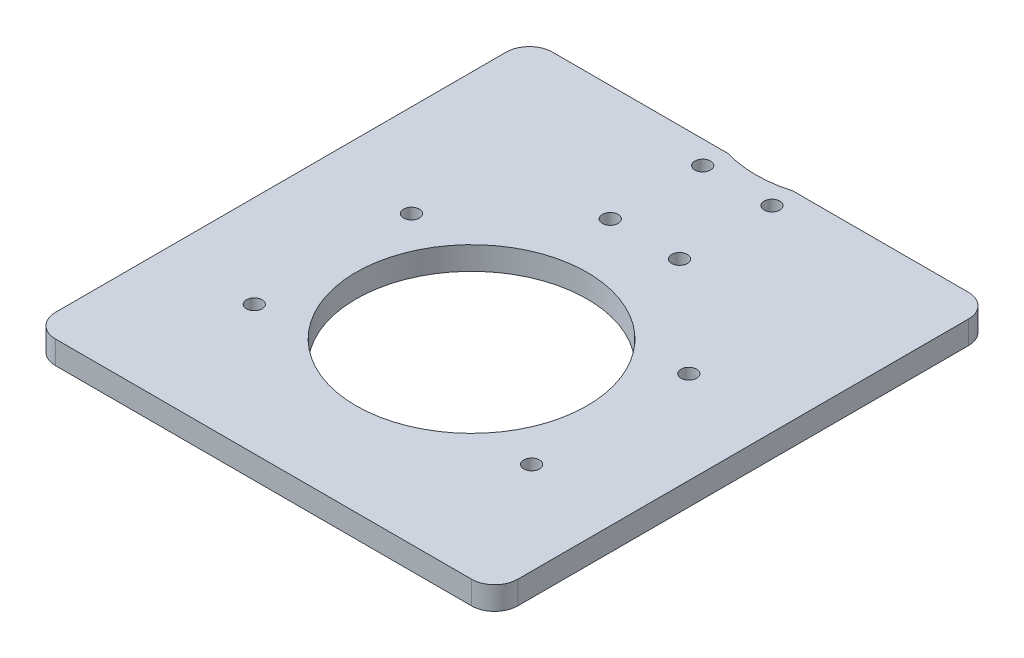
ISO-10303-21;
HEADER;
FILE_DESCRIPTION(('STEP AP214'),'2;1');
FILE_NAME('part.step','',(''),(''),'','','');
FILE_SCHEMA(('AUTOMOTIVE_DESIGN { 1 0 10303 214 1 1 1 1 }'));
ENDSEC;
DATA;
#1=APPLICATION_CONTEXT('core data for automotive mechanical design processes');
#2=APPLICATION_PROTOCOL_DEFINITION('international standard','automotive_design',2000,#1);
#3=PRODUCT_CONTEXT('',#1,'mechanical');
#4=PRODUCT('Part','Part','',(#3));
#5=PRODUCT_RELATED_PRODUCT_CATEGORY('part','',(#4));
#6=PRODUCT_DEFINITION_FORMATION('','',#4);
#7=PRODUCT_DEFINITION_CONTEXT('part definition',#1,'design');
#8=PRODUCT_DEFINITION('design','',#6,#7);
#9=PRODUCT_DEFINITION_SHAPE('','',#8);
#10=(LENGTH_UNIT() NAMED_UNIT(*) SI_UNIT(.MILLI.,.METRE.));
#11=(NAMED_UNIT(*) PLANE_ANGLE_UNIT() SI_UNIT($,.RADIAN.));
#12=(NAMED_UNIT(*) SI_UNIT($,.STERADIAN.) SOLID_ANGLE_UNIT());
#13=UNCERTAINTY_MEASURE_WITH_UNIT(LENGTH_MEASURE(1.E-05),#10,'distance_accuracy_value','');
#14=(GEOMETRIC_REPRESENTATION_CONTEXT(3) GLOBAL_UNCERTAINTY_ASSIGNED_CONTEXT((#13)) GLOBAL_UNIT_ASSIGNED_CONTEXT((#10,
#11,#12)) REPRESENTATION_CONTEXT('',''));
#15=CARTESIAN_POINT('',(0.,0.,0.));
#16=DIRECTION('',(0.,0.,1.));
#17=DIRECTION('',(1.,0.,0.));
#18=AXIS2_PLACEMENT_3D('',#15,#16,#17);
#19=CARTESIAN_POINT('',(100.,10.,-107.5));
#20=DIRECTION('',(0.,0.,1.));
#21=DIRECTION('',(1.,0.,0.));
#22=AXIS2_PLACEMENT_3D('',#19,#20,#21);
#23=PLANE('',#22);
#24=DIRECTION('',(-1.,0.,0.));
#25=VECTOR('',#24,1.);
#26=CARTESIAN_POINT('',(100.,10.,-107.5));
#27=LINE('',#26,#25);
#28=CARTESIAN_POINT('',(90.,10.,-107.5));
#29=VERTEX_POINT('',#28);
#30=CARTESIAN_POINT('',(13.9999999999999,10.,-107.5));
#31=VERTEX_POINT('',#30);
#32=EDGE_CURVE('E220',#29,#31,#27,.T.);
#33=ORIENTED_EDGE('',*,*,#32,.F.);
#34=DIRECTION('',(0.,-1.,0.));
#35=VECTOR('',#34,1.);
#36=CARTESIAN_POINT('',(90.,10.,-107.5));
#37=LINE('',#36,#35);
#38=CARTESIAN_POINT('',(90.,0.,-107.5));
#39=VERTEX_POINT('',#38);
#40=EDGE_CURVE('E11',#29,#39,#37,.T.);
#41=ORIENTED_EDGE('',*,*,#40,.T.);
#42=DIRECTION('',(-1.,0.,0.));
#43=VECTOR('',#42,1.);
#44=CARTESIAN_POINT('',(100.,0.,-107.5));
#45=LINE('',#44,#43);
#46=CARTESIAN_POINT('',(13.9999999999999,0.,-107.5));
#47=VERTEX_POINT('',#46);
#48=EDGE_CURVE('E214',#39,#47,#45,.T.);
#49=ORIENTED_EDGE('',*,*,#48,.T.);
#50=DIRECTION('',(0.,1.,0.));
#51=VECTOR('',#50,1.);
#52=CARTESIAN_POINT('',(13.9999999999999,0.,-107.5));
#53=LINE('',#52,#51);
#54=EDGE_CURVE('E163',#47,#31,#53,.T.);
#55=ORIENTED_EDGE('',*,*,#54,.T.);
#56=EDGE_LOOP('',(#33,#41,#49,#55));
#57=FACE_BOUND('',#56,.T.);
#58=ADVANCED_FACE('F34',(#57),#23,.F.);
#59=CARTESIAN_POINT('',(-100.,10.,107.5));
#60=DIRECTION('',(1.,0.,0.));
#61=DIRECTION('',(0.,0.,-1.));
#62=AXIS2_PLACEMENT_3D('',#59,#60,#61);
#63=PLANE('',#62);
#64=DIRECTION('',(0.,0.,1.));
#65=VECTOR('',#64,1.);
#66=CARTESIAN_POINT('',(-100.,0.,107.5));
#67=LINE('',#66,#65);
#68=CARTESIAN_POINT('',(-100.,0.,-97.5));
#69=VERTEX_POINT('',#68);
#70=CARTESIAN_POINT('',(-100.,0.,97.5));
#71=VERTEX_POINT('',#70);
#72=EDGE_CURVE('E210',#69,#71,#67,.T.);
#73=ORIENTED_EDGE('',*,*,#72,.T.);
#74=DIRECTION('',(0.,-1.,0.));
#75=VECTOR('',#74,1.);
#76=CARTESIAN_POINT('',(-100.,10.,97.5));
#77=LINE('',#76,#75);
#78=CARTESIAN_POINT('',(-100.,10.,97.5));
#79=VERTEX_POINT('',#78);
#80=EDGE_CURVE('E57',#71,#79,#77,.F.);
#81=ORIENTED_EDGE('',*,*,#80,.T.);
#82=DIRECTION('',(0.,0.,1.));
#83=VECTOR('',#82,1.);
#84=CARTESIAN_POINT('',(-100.,10.,107.5));
#85=LINE('',#84,#83);
#86=CARTESIAN_POINT('',(-100.,10.,-97.5));
#87=VERTEX_POINT('',#86);
#88=EDGE_CURVE('E211',#87,#79,#85,.T.);
#89=ORIENTED_EDGE('',*,*,#88,.F.);
#90=DIRECTION('',(0.,-1.,0.));
#91=VECTOR('',#90,1.);
#92=CARTESIAN_POINT('',(-100.,10.,-97.5));
#93=LINE('',#92,#91);
#94=EDGE_CURVE('E269',#87,#69,#93,.T.);
#95=ORIENTED_EDGE('',*,*,#94,.T.);
#96=EDGE_LOOP('',(#73,#81,#89,#95));
#97=FACE_BOUND('',#96,.T.);
#98=ADVANCED_FACE('F287',(#97),#63,.F.);
#99=CARTESIAN_POINT('',(100.,10.,107.5));
#100=DIRECTION('',(0.,0.,-1.));
#101=DIRECTION('',(-1.,0.,0.));
#102=AXIS2_PLACEMENT_3D('',#99,#100,#101);
#103=PLANE('',#102);
#104=DIRECTION('',(1.,0.,0.));
#105=VECTOR('',#104,1.);
#106=CARTESIAN_POINT('',(100.,0.,107.5));
#107=LINE('',#106,#105);
#108=CARTESIAN_POINT('',(-90.,0.,107.5));
#109=VERTEX_POINT('',#108);
#110=CARTESIAN_POINT('',(90.,0.,107.5));
#111=VERTEX_POINT('',#110);
#112=EDGE_CURVE('E224',#109,#111,#107,.T.);
#113=ORIENTED_EDGE('',*,*,#112,.T.);
#114=DIRECTION('',(0.,-1.,0.));
#115=VECTOR('',#114,1.);
#116=CARTESIAN_POINT('',(90.,10.,107.5));
#117=LINE('',#116,#115);
#118=CARTESIAN_POINT('',(90.,10.,107.5));
#119=VERTEX_POINT('',#118);
#120=EDGE_CURVE('E260',#111,#119,#117,.F.);
#121=ORIENTED_EDGE('',*,*,#120,.T.);
#122=DIRECTION('',(1.,0.,0.));
#123=VECTOR('',#122,1.);
#124=CARTESIAN_POINT('',(100.,10.,107.5));
#125=LINE('',#124,#123);
#126=CARTESIAN_POINT('',(-90.,10.,107.5));
#127=VERTEX_POINT('',#126);
#128=EDGE_CURVE('E213',#127,#119,#125,.T.);
#129=ORIENTED_EDGE('',*,*,#128,.F.);
#130=DIRECTION('',(0.,-1.,0.));
#131=VECTOR('',#130,1.);
#132=CARTESIAN_POINT('',(-90.,10.,107.5));
#133=LINE('',#132,#131);
#134=EDGE_CURVE('E257',#127,#109,#133,.T.);
#135=ORIENTED_EDGE('',*,*,#134,.T.);
#136=EDGE_LOOP('',(#113,#121,#129,#135));
#137=FACE_BOUND('',#136,.T.);
#138=ADVANCED_FACE('F298',(#137),#103,.F.);
#139=CARTESIAN_POINT('',(100.,10.,107.5));
#140=DIRECTION('',(-1.,0.,0.));
#141=DIRECTION('',(0.,0.,1.));
#142=AXIS2_PLACEMENT_3D('',#139,#140,#141);
#143=PLANE('',#142);
#144=DIRECTION('',(0.,0.,-1.));
#145=VECTOR('',#144,1.);
#146=CARTESIAN_POINT('',(100.,10.,107.5));
#147=LINE('',#146,#145);
#148=CARTESIAN_POINT('',(100.,10.,97.5));
#149=VERTEX_POINT('',#148);
#150=CARTESIAN_POINT('',(100.,10.,-97.5));
#151=VERTEX_POINT('',#150);
#152=EDGE_CURVE('E217',#149,#151,#147,.T.);
#153=ORIENTED_EDGE('',*,*,#152,.F.);
#154=DIRECTION('',(0.,-1.,0.));
#155=VECTOR('',#154,1.);
#156=CARTESIAN_POINT('',(100.,10.,97.5));
#157=LINE('',#156,#155);
#158=CARTESIAN_POINT('',(100.,0.,97.5));
#159=VERTEX_POINT('',#158);
#160=EDGE_CURVE('E246',#149,#159,#157,.T.);
#161=ORIENTED_EDGE('',*,*,#160,.T.);
#162=DIRECTION('',(0.,0.,-1.));
#163=VECTOR('',#162,1.);
#164=CARTESIAN_POINT('',(100.,0.,107.5));
#165=LINE('',#164,#163);
#166=CARTESIAN_POINT('',(100.,0.,-97.5));
#167=VERTEX_POINT('',#166);
#168=EDGE_CURVE('E227',#159,#167,#165,.T.);
#169=ORIENTED_EDGE('',*,*,#168,.T.);
#170=DIRECTION('',(0.,-1.,0.));
#171=VECTOR('',#170,1.);
#172=CARTESIAN_POINT('',(100.,10.,-97.5));
#173=LINE('',#172,#171);
#174=EDGE_CURVE('E244',#167,#151,#173,.F.);
#175=ORIENTED_EDGE('',*,*,#174,.T.);
#176=EDGE_LOOP('',(#153,#161,#169,#175));
#177=FACE_BOUND('',#176,.T.);
#178=ADVANCED_FACE('F306',(#177),#143,.F.);
#179=CARTESIAN_POINT('',(-13.9999999999999,0.,-107.5));
#180=VERTEX_POINT('',#179);
#181=CARTESIAN_POINT('',(-90.,0.,-107.5));
#182=VERTEX_POINT('',#181);
#183=EDGE_CURVE('E230',#180,#182,#45,.T.);
#184=ORIENTED_EDGE('',*,*,#183,.T.);
#185=DIRECTION('',(0.,-1.,0.));
#186=VECTOR('',#185,1.);
#187=CARTESIAN_POINT('',(-90.,10.,-107.5));
#188=LINE('',#187,#186);
#189=CARTESIAN_POINT('',(-90.,10.,-107.5));
#190=VERTEX_POINT('',#189);
#191=EDGE_CURVE('E42',#182,#190,#188,.F.);
#192=ORIENTED_EDGE('',*,*,#191,.T.);
#193=CARTESIAN_POINT('',(-13.9999999999999,10.,-107.5));
#194=VERTEX_POINT('',#193);
#195=EDGE_CURVE('E219',#194,#190,#27,.T.);
#196=ORIENTED_EDGE('',*,*,#195,.F.);
#197=DIRECTION('',(0.,1.,0.));
#198=VECTOR('',#197,1.);
#199=CARTESIAN_POINT('',(-13.9999999999999,0.,-107.5));
#200=LINE('',#199,#198);
#201=EDGE_CURVE('E160',#194,#180,#200,.F.);
#202=ORIENTED_EDGE('',*,*,#201,.T.);
#203=EDGE_LOOP('',(#184,#192,#196,#202));
#204=FACE_BOUND('',#203,.T.);
#205=ADVANCED_FACE('F277',(#204),#23,.F.);
#206=CARTESIAN_POINT('',(0.,10.,0.));
#207=DIRECTION('',(0.,1.,0.));
#208=DIRECTION('',(0.,0.,1.));
#209=AXIS2_PLACEMENT_3D('',#206,#207,#208);
#210=PLANE('',#209);
#211=ORIENTED_EDGE('',*,*,#128,.T.);
#212=CARTESIAN_POINT('',(90.,10.,97.5));
#213=DIRECTION('',(0.,1.,0.));
#214=DIRECTION('',(0.,0.,1.));
#215=AXIS2_PLACEMENT_3D('',#212,#213,#214);
#216=CIRCLE('',#215,10.);
#217=EDGE_CURVE('E267',#119,#149,#216,.T.);
#218=ORIENTED_EDGE('',*,*,#217,.T.);
#219=ORIENTED_EDGE('',*,*,#152,.T.);
#220=CARTESIAN_POINT('',(90.,10.,-97.5));
#221=DIRECTION('',(0.,1.,0.));
#222=DIRECTION('',(0.,0.,1.));
#223=AXIS2_PLACEMENT_3D('',#220,#221,#222);
#224=CIRCLE('',#223,10.);
#225=EDGE_CURVE('E49',#151,#29,#224,.T.);
#226=ORIENTED_EDGE('',*,*,#225,.T.);
#227=ORIENTED_EDGE('',*,*,#32,.T.);
#228=CARTESIAN_POINT('',(0.,10.,-155.5));
#229=DIRECTION('',(0.,1.,0.));
#230=DIRECTION('',(0.,0.,1.));
#231=AXIS2_PLACEMENT_3D('',#228,#229,#230);
#232=CIRCLE('',#231,50.);
#233=EDGE_CURVE('E157',#194,#31,#232,.T.);
#234=ORIENTED_EDGE('',*,*,#233,.F.);
#235=ORIENTED_EDGE('',*,*,#195,.T.);
#236=CARTESIAN_POINT('',(-90.,10.,-97.5));
#237=DIRECTION('',(0.,1.,0.));
#238=DIRECTION('',(0.,0.,1.));
#239=AXIS2_PLACEMENT_3D('',#236,#237,#238);
#240=CIRCLE('',#239,10.);
#241=EDGE_CURVE('E263',#190,#87,#240,.T.);
#242=ORIENTED_EDGE('',*,*,#241,.T.);
#243=ORIENTED_EDGE('',*,*,#88,.T.);
#244=CARTESIAN_POINT('',(-90.,10.,97.5));
#245=DIRECTION('',(0.,1.,0.));
#246=DIRECTION('',(0.,0.,1.));
#247=AXIS2_PLACEMENT_3D('',#244,#245,#246);
#248=CIRCLE('',#247,10.);
#249=EDGE_CURVE('E265',#79,#127,#248,.T.);
#250=ORIENTED_EDGE('',*,*,#249,.T.);
#251=EDGE_LOOP('',(#211,#218,#219,#226,#227,#234,#235,#242,#243,#250));
#252=FACE_BOUND('',#251,.T.);
#253=CARTESIAN_POINT('',(0.,10.,17.5));
#254=DIRECTION('',(0.,1.,0.));
#255=DIRECTION('',(0.,0.,1.));
#256=AXIS2_PLACEMENT_3D('',#253,#254,#255);
#257=CIRCLE('',#256,50.);
#258=CARTESIAN_POINT('',(0.,10.,67.5));
#259=VERTEX_POINT('',#258);
#260=EDGE_CURVE('E166',#259,#259,#257,.T.);
#261=ORIENTED_EDGE('',*,*,#260,.F.);
#262=EDGE_LOOP('',(#261));
#263=FACE_BOUND('',#262,.T.);
#264=CARTESIAN_POINT('',(-15.,10.,-97.5));
#265=DIRECTION('',(0.,1.,0.));
#266=DIRECTION('',(0.,0.,1.));
#267=AXIS2_PLACEMENT_3D('',#264,#265,#266);
#268=CIRCLE('',#267,3.39999999999999);
#269=CARTESIAN_POINT('',(-15.,10.,-94.1));
#270=VERTEX_POINT('',#269);
#271=EDGE_CURVE('E170',#270,#270,#268,.T.);
#272=ORIENTED_EDGE('',*,*,#271,.F.);
#273=EDGE_LOOP('',(#272));
#274=FACE_BOUND('',#273,.T.);
#275=CARTESIAN_POINT('',(-15.,10.,-57.5));
#276=DIRECTION('',(0.,1.,0.));
#277=DIRECTION('',(0.,0.,1.));
#278=AXIS2_PLACEMENT_3D('',#275,#276,#277);
#279=CIRCLE('',#278,3.39999999999999);
#280=CARTESIAN_POINT('',(-15.,10.,-54.1));
#281=VERTEX_POINT('',#280);
#282=EDGE_CURVE('E176',#281,#281,#279,.T.);
#283=ORIENTED_EDGE('',*,*,#282,.F.);
#284=EDGE_LOOP('',(#283));
#285=FACE_BOUND('',#284,.T.);
#286=CARTESIAN_POINT('',(15.,10.,-57.5));
#287=DIRECTION('',(0.,1.,0.));
#288=DIRECTION('',(0.,0.,1.));
#289=AXIS2_PLACEMENT_3D('',#286,#287,#288);
#290=CIRCLE('',#289,3.39999999999999);
#291=CARTESIAN_POINT('',(15.,10.,-54.1));
#292=VERTEX_POINT('',#291);
#293=EDGE_CURVE('E180',#292,#292,#290,.T.);
#294=ORIENTED_EDGE('',*,*,#293,.F.);
#295=EDGE_LOOP('',(#294));
#296=FACE_BOUND('',#295,.T.);
#297=CARTESIAN_POINT('',(15.,10.,-97.5));
#298=DIRECTION('',(0.,1.,0.));
#299=DIRECTION('',(0.,0.,1.));
#300=AXIS2_PLACEMENT_3D('',#297,#298,#299);
#301=CIRCLE('',#300,3.39999999999999);
#302=CARTESIAN_POINT('',(15.,10.,-94.1));
#303=VERTEX_POINT('',#302);
#304=EDGE_CURVE('E184',#303,#303,#301,.T.);
#305=ORIENTED_EDGE('',*,*,#304,.F.);
#306=EDGE_LOOP('',(#305));
#307=FACE_BOUND('',#306,.T.);
#308=CARTESIAN_POINT('',(-60.,10.,-16.5));
#309=DIRECTION('',(0.,1.,0.));
#310=DIRECTION('',(0.,0.,1.));
#311=AXIS2_PLACEMENT_3D('',#308,#309,#310);
#312=CIRCLE('',#311,3.39999999999999);
#313=CARTESIAN_POINT('',(-60.,10.,-13.1));
#314=VERTEX_POINT('',#313);
#315=EDGE_CURVE('E188',#314,#314,#312,.T.);
#316=ORIENTED_EDGE('',*,*,#315,.F.);
#317=EDGE_LOOP('',(#316));
#318=FACE_BOUND('',#317,.T.);
#319=CARTESIAN_POINT('',(60.,10.,-16.5));
#320=DIRECTION('',(0.,1.,0.));
#321=DIRECTION('',(0.,0.,1.));
#322=AXIS2_PLACEMENT_3D('',#319,#320,#321);
#323=CIRCLE('',#322,3.39999999999999);
#324=CARTESIAN_POINT('',(60.,10.,-13.1));
#325=VERTEX_POINT('',#324);
#326=EDGE_CURVE('E194',#325,#325,#323,.T.);
#327=ORIENTED_EDGE('',*,*,#326,.F.);
#328=EDGE_LOOP('',(#327));
#329=FACE_BOUND('',#328,.T.);
#330=CARTESIAN_POINT('',(-60.,10.,51.5));
#331=DIRECTION('',(0.,1.,0.));
#332=DIRECTION('',(0.,0.,1.));
#333=AXIS2_PLACEMENT_3D('',#330,#331,#332);
#334=CIRCLE('',#333,3.39999999999999);
#335=CARTESIAN_POINT('',(-60.,10.,54.9));
#336=VERTEX_POINT('',#335);
#337=EDGE_CURVE('E200',#336,#336,#334,.T.);
#338=ORIENTED_EDGE('',*,*,#337,.F.);
#339=EDGE_LOOP('',(#338));
#340=FACE_BOUND('',#339,.T.);
#341=CARTESIAN_POINT('',(60.,10.,51.5));
#342=DIRECTION('',(0.,1.,0.));
#343=DIRECTION('',(0.,0.,1.));
#344=AXIS2_PLACEMENT_3D('',#341,#342,#343);
#345=CIRCLE('',#344,3.39999999999999);
#346=CARTESIAN_POINT('',(60.,10.,54.9));
#347=VERTEX_POINT('',#346);
#348=EDGE_CURVE('E204',#347,#347,#345,.T.);
#349=ORIENTED_EDGE('',*,*,#348,.F.);
#350=EDGE_LOOP('',(#349));
#351=FACE_BOUND('',#350,.T.);
#352=ADVANCED_FACE('F282',(#252,#263,#274,#285,#296,#307,#318,#329,#340,#351),#210,.T.);
#353=CARTESIAN_POINT('',(0.,0.,0.));
#354=DIRECTION('',(0.,1.,0.));
#355=DIRECTION('',(0.,0.,1.));
#356=AXIS2_PLACEMENT_3D('',#353,#354,#355);
#357=PLANE('',#356);
#358=CARTESIAN_POINT('',(-56.,0.,-38.5));
#359=DIRECTION('',(0.,-1.,0.));
#360=DIRECTION('',(0.,0.,-1.));
#361=AXIS2_PLACEMENT_3D('',#358,#359,#360);
#362=CIRCLE('',#361,2.49999999999999);
#363=CARTESIAN_POINT('',(-56.,0.,-41.));
#364=VERTEX_POINT('',#363);
#365=EDGE_CURVE('E135',#364,#364,#362,.T.);
#366=ORIENTED_EDGE('',*,*,#365,.F.);
#367=EDGE_LOOP('',(#366));
#368=FACE_BOUND('',#367,.T.);
#369=CARTESIAN_POINT('',(56.,0.,-38.5));
#370=DIRECTION('',(0.,-1.,0.));
#371=DIRECTION('',(0.,0.,-1.));
#372=AXIS2_PLACEMENT_3D('',#369,#370,#371);
#373=CIRCLE('',#372,2.49999999999999);
#374=CARTESIAN_POINT('',(56.,0.,-41.));
#375=VERTEX_POINT('',#374);
#376=EDGE_CURVE('E134',#375,#375,#373,.T.);
#377=ORIENTED_EDGE('',*,*,#376,.F.);
#378=EDGE_LOOP('',(#377));
#379=FACE_BOUND('',#378,.T.);
#380=CARTESIAN_POINT('',(-56.,0.,73.5));
#381=DIRECTION('',(0.,-1.,0.));
#382=DIRECTION('',(0.,0.,-1.));
#383=AXIS2_PLACEMENT_3D('',#380,#381,#382);
#384=CIRCLE('',#383,2.49999999999999);
#385=CARTESIAN_POINT('',(-56.,0.,71.));
#386=VERTEX_POINT('',#385);
#387=EDGE_CURVE('E145',#386,#386,#384,.T.);
#388=ORIENTED_EDGE('',*,*,#387,.F.);
#389=EDGE_LOOP('',(#388));
#390=FACE_BOUND('',#389,.T.);
#391=CARTESIAN_POINT('',(56.,0.,73.5));
#392=DIRECTION('',(0.,-1.,0.));
#393=DIRECTION('',(0.,0.,-1.));
#394=AXIS2_PLACEMENT_3D('',#391,#392,#393);
#395=CIRCLE('',#394,2.49999999999999);
#396=CARTESIAN_POINT('',(56.,0.,71.));
#397=VERTEX_POINT('',#396);
#398=EDGE_CURVE('E151',#397,#397,#395,.T.);
#399=ORIENTED_EDGE('',*,*,#398,.F.);
#400=EDGE_LOOP('',(#399));
#401=FACE_BOUND('',#400,.T.);
#402=CARTESIAN_POINT('',(0.,0.,17.5));
#403=DIRECTION('',(0.,1.,0.));
#404=DIRECTION('',(0.,0.,1.));
#405=AXIS2_PLACEMENT_3D('',#402,#403,#404);
#406=CIRCLE('',#405,50.);
#407=CARTESIAN_POINT('',(0.,0.,67.5));
#408=VERTEX_POINT('',#407);
#409=EDGE_CURVE('E167',#408,#408,#406,.T.);
#410=ORIENTED_EDGE('',*,*,#409,.T.);
#411=EDGE_LOOP('',(#410));
#412=FACE_BOUND('',#411,.T.);
#413=CARTESIAN_POINT('',(-15.,0.,-97.5));
#414=DIRECTION('',(0.,1.,0.));
#415=DIRECTION('',(0.,0.,1.));
#416=AXIS2_PLACEMENT_3D('',#413,#414,#415);
#417=CIRCLE('',#416,3.39999999999999);
#418=CARTESIAN_POINT('',(-15.,0.,-94.1));
#419=VERTEX_POINT('',#418);
#420=EDGE_CURVE('E175',#419,#419,#417,.T.);
#421=ORIENTED_EDGE('',*,*,#420,.T.);
#422=EDGE_LOOP('',(#421));
#423=FACE_BOUND('',#422,.T.);
#424=CARTESIAN_POINT('',(-15.,0.,-57.5));
#425=DIRECTION('',(0.,1.,0.));
#426=DIRECTION('',(0.,0.,1.));
#427=AXIS2_PLACEMENT_3D('',#424,#425,#426);
#428=CIRCLE('',#427,3.39999999999999);
#429=CARTESIAN_POINT('',(-15.,0.,-54.1));
#430=VERTEX_POINT('',#429);
#431=EDGE_CURVE('E179',#430,#430,#428,.T.);
#432=ORIENTED_EDGE('',*,*,#431,.T.);
#433=EDGE_LOOP('',(#432));
#434=FACE_BOUND('',#433,.T.);
#435=CARTESIAN_POINT('',(15.,0.,-57.5));
#436=DIRECTION('',(0.,1.,0.));
#437=DIRECTION('',(0.,0.,1.));
#438=AXIS2_PLACEMENT_3D('',#435,#436,#437);
#439=CIRCLE('',#438,3.39999999999999);
#440=CARTESIAN_POINT('',(15.,0.,-54.1));
#441=VERTEX_POINT('',#440);
#442=EDGE_CURVE('E183',#441,#441,#439,.T.);
#443=ORIENTED_EDGE('',*,*,#442,.T.);
#444=EDGE_LOOP('',(#443));
#445=FACE_BOUND('',#444,.T.);
#446=CARTESIAN_POINT('',(15.,0.,-97.5));
#447=DIRECTION('',(0.,1.,0.));
#448=DIRECTION('',(0.,0.,1.));
#449=AXIS2_PLACEMENT_3D('',#446,#447,#448);
#450=CIRCLE('',#449,3.39999999999999);
#451=CARTESIAN_POINT('',(15.,0.,-94.1));
#452=VERTEX_POINT('',#451);
#453=EDGE_CURVE('E187',#452,#452,#450,.T.);
#454=ORIENTED_EDGE('',*,*,#453,.T.);
#455=EDGE_LOOP('',(#454));
#456=FACE_BOUND('',#455,.T.);
#457=CARTESIAN_POINT('',(-60.,0.,-16.5));
#458=DIRECTION('',(0.,1.,0.));
#459=DIRECTION('',(0.,0.,1.));
#460=AXIS2_PLACEMENT_3D('',#457,#458,#459);
#461=CIRCLE('',#460,3.39999999999999);
#462=CARTESIAN_POINT('',(-60.,0.,-13.1));
#463=VERTEX_POINT('',#462);
#464=EDGE_CURVE('E191',#463,#463,#461,.T.);
#465=ORIENTED_EDGE('',*,*,#464,.T.);
#466=EDGE_LOOP('',(#465));
#467=FACE_BOUND('',#466,.T.);
#468=CARTESIAN_POINT('',(60.,0.,-16.5));
#469=DIRECTION('',(0.,1.,0.));
#470=DIRECTION('',(0.,0.,1.));
#471=AXIS2_PLACEMENT_3D('',#468,#469,#470);
#472=CIRCLE('',#471,3.39999999999999);
#473=CARTESIAN_POINT('',(60.,0.,-13.1));
#474=VERTEX_POINT('',#473);
#475=EDGE_CURVE('E197',#474,#474,#472,.T.);
#476=ORIENTED_EDGE('',*,*,#475,.T.);
#477=EDGE_LOOP('',(#476));
#478=FACE_BOUND('',#477,.T.);
#479=CARTESIAN_POINT('',(-60.,0.,51.5));
#480=DIRECTION('',(0.,1.,0.));
#481=DIRECTION('',(0.,0.,1.));
#482=AXIS2_PLACEMENT_3D('',#479,#480,#481);
#483=CIRCLE('',#482,3.39999999999999);
#484=CARTESIAN_POINT('',(-60.,0.,54.9));
#485=VERTEX_POINT('',#484);
#486=EDGE_CURVE('E203',#485,#485,#483,.T.);
#487=ORIENTED_EDGE('',*,*,#486,.T.);
#488=EDGE_LOOP('',(#487));
#489=FACE_BOUND('',#488,.T.);
#490=CARTESIAN_POINT('',(60.,0.,51.5));
#491=DIRECTION('',(0.,1.,0.));
#492=DIRECTION('',(0.,0.,1.));
#493=AXIS2_PLACEMENT_3D('',#490,#491,#492);
#494=CIRCLE('',#493,3.39999999999999);
#495=CARTESIAN_POINT('',(60.,0.,54.9));
#496=VERTEX_POINT('',#495);
#497=EDGE_CURVE('E207',#496,#496,#494,.T.);
#498=ORIENTED_EDGE('',*,*,#497,.T.);
#499=EDGE_LOOP('',(#498));
#500=FACE_BOUND('',#499,.T.);
#501=ORIENTED_EDGE('',*,*,#168,.F.);
#502=CARTESIAN_POINT('',(90.,0.,97.5));
#503=DIRECTION('',(0.,1.,0.));
#504=DIRECTION('',(0.,0.,1.));
#505=AXIS2_PLACEMENT_3D('',#502,#503,#504);
#506=CIRCLE('',#505,10.);
#507=EDGE_CURVE('E255',#159,#111,#506,.F.);
#508=ORIENTED_EDGE('',*,*,#507,.T.);
#509=ORIENTED_EDGE('',*,*,#112,.F.);
#510=CARTESIAN_POINT('',(-90.,0.,97.5));
#511=DIRECTION('',(0.,1.,0.));
#512=DIRECTION('',(0.,0.,1.));
#513=AXIS2_PLACEMENT_3D('',#510,#511,#512);
#514=CIRCLE('',#513,10.);
#515=EDGE_CURVE('E253',#109,#71,#514,.F.);
#516=ORIENTED_EDGE('',*,*,#515,.T.);
#517=ORIENTED_EDGE('',*,*,#72,.F.);
#518=CARTESIAN_POINT('',(-90.,0.,-97.5));
#519=DIRECTION('',(0.,1.,0.));
#520=DIRECTION('',(0.,0.,1.));
#521=AXIS2_PLACEMENT_3D('',#518,#519,#520);
#522=CIRCLE('',#521,10.);
#523=EDGE_CURVE('E251',#69,#182,#522,.F.);
#524=ORIENTED_EDGE('',*,*,#523,.T.);
#525=ORIENTED_EDGE('',*,*,#183,.F.);
#526=CARTESIAN_POINT('',(0.,0.,-155.5));
#527=DIRECTION('',(0.,1.,0.));
#528=DIRECTION('',(0.,0.,1.));
#529=AXIS2_PLACEMENT_3D('',#526,#527,#528);
#530=CIRCLE('',#529,50.);
#531=EDGE_CURVE('E222',#180,#47,#530,.T.);
#532=ORIENTED_EDGE('',*,*,#531,.T.);
#533=ORIENTED_EDGE('',*,*,#48,.F.);
#534=CARTESIAN_POINT('',(90.,0.,-97.5));
#535=DIRECTION('',(0.,1.,0.));
#536=DIRECTION('',(0.,0.,1.));
#537=AXIS2_PLACEMENT_3D('',#534,#535,#536);
#538=CIRCLE('',#537,10.);
#539=EDGE_CURVE('E249',#39,#167,#538,.F.);
#540=ORIENTED_EDGE('',*,*,#539,.T.);
#541=EDGE_LOOP('',(#501,#508,#509,#516,#517,#524,#525,#532,#533,#540));
#542=FACE_BOUND('',#541,.T.);
#543=ADVANCED_FACE('F290',(#368,#379,#390,#401,#412,#423,#434,#445,#456,#467,#478,#489,#500,
#542),#357,.F.);
#544=CARTESIAN_POINT('',(60.,10.,51.5));
#545=DIRECTION('',(0.,1.,0.));
#546=DIRECTION('',(0.,0.,1.));
#547=AXIS2_PLACEMENT_3D('',#544,#545,#546);
#548=CYLINDRICAL_SURFACE('',#547,3.39999999999999);
#549=ORIENTED_EDGE('',*,*,#348,.T.);
#550=EDGE_LOOP('',(#549));
#551=FACE_BOUND('',#550,.T.);
#552=ORIENTED_EDGE('',*,*,#497,.F.);
#553=EDGE_LOOP('',(#552));
#554=FACE_BOUND('',#553,.T.);
#555=ADVANCED_FACE('F387',(#551,#554),#548,.F.);
#556=CARTESIAN_POINT('',(-60.,10.,51.5));
#557=DIRECTION('',(0.,1.,0.));
#558=DIRECTION('',(0.,0.,1.));
#559=AXIS2_PLACEMENT_3D('',#556,#557,#558);
#560=CYLINDRICAL_SURFACE('',#559,3.39999999999999);
#561=ORIENTED_EDGE('',*,*,#337,.T.);
#562=EDGE_LOOP('',(#561));
#563=FACE_BOUND('',#562,.T.);
#564=ORIENTED_EDGE('',*,*,#486,.F.);
#565=EDGE_LOOP('',(#564));
#566=FACE_BOUND('',#565,.T.);
#567=ADVANCED_FACE('F413',(#563,#566),#560,.F.);
#568=CARTESIAN_POINT('',(60.,10.,-16.5));
#569=DIRECTION('',(0.,1.,0.));
#570=DIRECTION('',(0.,0.,1.));
#571=AXIS2_PLACEMENT_3D('',#568,#569,#570);
#572=CYLINDRICAL_SURFACE('',#571,3.39999999999999);
#573=ORIENTED_EDGE('',*,*,#326,.T.);
#574=EDGE_LOOP('',(#573));
#575=FACE_BOUND('',#574,.T.);
#576=ORIENTED_EDGE('',*,*,#475,.F.);
#577=EDGE_LOOP('',(#576));
#578=FACE_BOUND('',#577,.T.);
#579=ADVANCED_FACE('F419',(#575,#578),#572,.F.);
#580=CARTESIAN_POINT('',(-60.,10.,-16.5));
#581=DIRECTION('',(0.,1.,0.));
#582=DIRECTION('',(0.,0.,1.));
#583=AXIS2_PLACEMENT_3D('',#580,#581,#582);
#584=CYLINDRICAL_SURFACE('',#583,3.39999999999999);
#585=ORIENTED_EDGE('',*,*,#315,.T.);
#586=EDGE_LOOP('',(#585));
#587=FACE_BOUND('',#586,.T.);
#588=ORIENTED_EDGE('',*,*,#464,.F.);
#589=EDGE_LOOP('',(#588));
#590=FACE_BOUND('',#589,.T.);
#591=ADVANCED_FACE('F425',(#587,#590),#584,.F.);
#592=CARTESIAN_POINT('',(15.,10.,-97.5));
#593=DIRECTION('',(0.,1.,0.));
#594=DIRECTION('',(0.,0.,1.));
#595=AXIS2_PLACEMENT_3D('',#592,#593,#594);
#596=CYLINDRICAL_SURFACE('',#595,3.39999999999999);
#597=ORIENTED_EDGE('',*,*,#304,.T.);
#598=EDGE_LOOP('',(#597));
#599=FACE_BOUND('',#598,.T.);
#600=ORIENTED_EDGE('',*,*,#453,.F.);
#601=EDGE_LOOP('',(#600));
#602=FACE_BOUND('',#601,.T.);
#603=ADVANCED_FACE('F429',(#599,#602),#596,.F.);
#604=CARTESIAN_POINT('',(15.,10.,-57.5));
#605=DIRECTION('',(0.,1.,0.));
#606=DIRECTION('',(0.,0.,1.));
#607=AXIS2_PLACEMENT_3D('',#604,#605,#606);
#608=CYLINDRICAL_SURFACE('',#607,3.39999999999999);
#609=ORIENTED_EDGE('',*,*,#293,.T.);
#610=EDGE_LOOP('',(#609));
#611=FACE_BOUND('',#610,.T.);
#612=ORIENTED_EDGE('',*,*,#442,.F.);
#613=EDGE_LOOP('',(#612));
#614=FACE_BOUND('',#613,.T.);
#615=ADVANCED_FACE('F433',(#611,#614),#608,.F.);
#616=CARTESIAN_POINT('',(-15.,10.,-57.5));
#617=DIRECTION('',(0.,1.,0.));
#618=DIRECTION('',(0.,0.,1.));
#619=AXIS2_PLACEMENT_3D('',#616,#617,#618);
#620=CYLINDRICAL_SURFACE('',#619,3.39999999999999);
#621=ORIENTED_EDGE('',*,*,#282,.T.);
#622=EDGE_LOOP('',(#621));
#623=FACE_BOUND('',#622,.T.);
#624=ORIENTED_EDGE('',*,*,#431,.F.);
#625=EDGE_LOOP('',(#624));
#626=FACE_BOUND('',#625,.T.);
#627=ADVANCED_FACE('F437',(#623,#626),#620,.F.);
#628=CARTESIAN_POINT('',(-15.,10.,-97.5));
#629=DIRECTION('',(0.,1.,0.));
#630=DIRECTION('',(0.,0.,1.));
#631=AXIS2_PLACEMENT_3D('',#628,#629,#630);
#632=CYLINDRICAL_SURFACE('',#631,3.39999999999999);
#633=ORIENTED_EDGE('',*,*,#271,.T.);
#634=EDGE_LOOP('',(#633));
#635=FACE_BOUND('',#634,.T.);
#636=ORIENTED_EDGE('',*,*,#420,.F.);
#637=EDGE_LOOP('',(#636));
#638=FACE_BOUND('',#637,.T.);
#639=ADVANCED_FACE('F323',(#635,#638),#632,.F.);
#640=CARTESIAN_POINT('',(0.,0.,17.5));
#641=DIRECTION('',(0.,1.,0.));
#642=DIRECTION('',(0.,0.,1.));
#643=AXIS2_PLACEMENT_3D('',#640,#641,#642);
#644=CYLINDRICAL_SURFACE('',#643,50.);
#645=ORIENTED_EDGE('',*,*,#409,.F.);
#646=EDGE_LOOP('',(#645));
#647=FACE_BOUND('',#646,.T.);
#648=ORIENTED_EDGE('',*,*,#260,.T.);
#649=EDGE_LOOP('',(#648));
#650=FACE_BOUND('',#649,.T.);
#651=ADVANCED_FACE('F316',(#647,#650),#644,.F.);
#652=CARTESIAN_POINT('',(0.,0.,-155.5));
#653=DIRECTION('',(0.,1.,0.));
#654=DIRECTION('',(0.,0.,1.));
#655=AXIS2_PLACEMENT_3D('',#652,#653,#654);
#656=CYLINDRICAL_SURFACE('',#655,50.);
#657=ORIENTED_EDGE('',*,*,#531,.F.);
#658=ORIENTED_EDGE('',*,*,#201,.F.);
#659=ORIENTED_EDGE('',*,*,#233,.T.);
#660=ORIENTED_EDGE('',*,*,#54,.F.);
#661=EDGE_LOOP('',(#657,#658,#659,#660));
#662=FACE_BOUND('',#661,.T.);
#663=ADVANCED_FACE('F314',(#662),#656,.F.);
#664=CARTESIAN_POINT('',(90.,10.,97.5));
#665=DIRECTION('',(0.,-1.,0.));
#666=DIRECTION('',(0.,0.,-1.));
#667=AXIS2_PLACEMENT_3D('',#664,#665,#666);
#668=CYLINDRICAL_SURFACE('',#667,10.);
#669=ORIENTED_EDGE('',*,*,#217,.F.);
#670=ORIENTED_EDGE('',*,*,#120,.F.);
#671=ORIENTED_EDGE('',*,*,#507,.F.);
#672=ORIENTED_EDGE('',*,*,#160,.F.);
#673=EDGE_LOOP('',(#669,#670,#671,#672));
#674=FACE_BOUND('',#673,.T.);
#675=ADVANCED_FACE('F304',(#674),#668,.T.);
#676=CARTESIAN_POINT('',(-90.,10.,97.5));
#677=DIRECTION('',(0.,-1.,0.));
#678=DIRECTION('',(0.,0.,-1.));
#679=AXIS2_PLACEMENT_3D('',#676,#677,#678);
#680=CYLINDRICAL_SURFACE('',#679,10.);
#681=ORIENTED_EDGE('',*,*,#249,.F.);
#682=ORIENTED_EDGE('',*,*,#80,.F.);
#683=ORIENTED_EDGE('',*,*,#515,.F.);
#684=ORIENTED_EDGE('',*,*,#134,.F.);
#685=EDGE_LOOP('',(#681,#682,#683,#684));
#686=FACE_BOUND('',#685,.T.);
#687=ADVANCED_FACE('F295',(#686),#680,.T.);
#688=CARTESIAN_POINT('',(-90.,10.,-97.5));
#689=DIRECTION('',(0.,-1.,0.));
#690=DIRECTION('',(0.,0.,-1.));
#691=AXIS2_PLACEMENT_3D('',#688,#689,#690);
#692=CYLINDRICAL_SURFACE('',#691,10.);
#693=ORIENTED_EDGE('',*,*,#241,.F.);
#694=ORIENTED_EDGE('',*,*,#191,.F.);
#695=ORIENTED_EDGE('',*,*,#523,.F.);
#696=ORIENTED_EDGE('',*,*,#94,.F.);
#697=EDGE_LOOP('',(#693,#694,#695,#696));
#698=FACE_BOUND('',#697,.T.);
#699=ADVANCED_FACE('F285',(#698),#692,.T.);
#700=CARTESIAN_POINT('',(90.,10.,-97.5));
#701=DIRECTION('',(0.,-1.,0.));
#702=DIRECTION('',(0.,0.,-1.));
#703=AXIS2_PLACEMENT_3D('',#700,#701,#702);
#704=CYLINDRICAL_SURFACE('',#703,10.);
#705=ORIENTED_EDGE('',*,*,#225,.F.);
#706=ORIENTED_EDGE('',*,*,#174,.F.);
#707=ORIENTED_EDGE('',*,*,#539,.F.);
#708=ORIENTED_EDGE('',*,*,#40,.F.);
#709=EDGE_LOOP('',(#705,#706,#707,#708));
#710=FACE_BOUND('',#709,.T.);
#711=ADVANCED_FACE('F36',(#710),#704,.T.);
#712=CARTESIAN_POINT('',(56.,8.,73.5));
#713=DIRECTION('',(0.,-1.,0.));
#714=DIRECTION('',(0.,0.,-1.));
#715=AXIS2_PLACEMENT_3D('',#712,#713,#714);
#716=CONICAL_SURFACE('',#715,2.5,1.02974425867665);
#717=CARTESIAN_POINT('',(56.,9.5021515475689,73.5));
#718=VERTEX_POINT('',#717);
#719=VERTEX_LOOP('',#718);
#720=FACE_BOUND('',#719,.T.);
#721=CARTESIAN_POINT('',(56.,8.,73.5));
#722=DIRECTION('',(0.,-1.,0.));
#723=DIRECTION('',(0.,0.,-1.));
#724=AXIS2_PLACEMENT_3D('',#721,#722,#723);
#725=CIRCLE('',#724,2.5);
#726=CARTESIAN_POINT('',(56.,8.,71.));
#727=VERTEX_POINT('',#726);
#728=EDGE_CURVE('E154',#727,#727,#725,.T.);
#729=ORIENTED_EDGE('',*,*,#728,.T.);
#730=EDGE_LOOP('',(#729));
#731=FACE_BOUND('',#730,.T.);
#732=ADVANCED_FACE('F351',(#720,#731),#716,.F.);
#733=CARTESIAN_POINT('',(56.,0.,73.5));
#734=DIRECTION('',(0.,-1.,0.));
#735=DIRECTION('',(0.,0.,-1.));
#736=AXIS2_PLACEMENT_3D('',#733,#734,#735);
#737=CYLINDRICAL_SURFACE('',#736,2.49999999999999);
#738=ORIENTED_EDGE('',*,*,#728,.F.);
#739=EDGE_LOOP('',(#738));
#740=FACE_BOUND('',#739,.T.);
#741=ORIENTED_EDGE('',*,*,#398,.T.);
#742=EDGE_LOOP('',(#741));
#743=FACE_BOUND('',#742,.T.);
#744=ADVANCED_FACE('F355',(#740,#743),#737,.F.);
#745=CARTESIAN_POINT('',(-56.,8.,73.5));
#746=DIRECTION('',(0.,-1.,0.));
#747=DIRECTION('',(0.,0.,-1.));
#748=AXIS2_PLACEMENT_3D('',#745,#746,#747);
#749=CONICAL_SURFACE('',#748,2.5,1.02974425867665);
#750=CARTESIAN_POINT('',(-56.,9.5021515475689,73.5));
#751=VERTEX_POINT('',#750);
#752=VERTEX_LOOP('',#751);
#753=FACE_BOUND('',#752,.T.);
#754=CARTESIAN_POINT('',(-56.,8.,73.5));
#755=DIRECTION('',(0.,-1.,0.));
#756=DIRECTION('',(0.,0.,-1.));
#757=AXIS2_PLACEMENT_3D('',#754,#755,#756);
#758=CIRCLE('',#757,2.5);
#759=CARTESIAN_POINT('',(-56.,8.,71.));
#760=VERTEX_POINT('',#759);
#761=EDGE_CURVE('E148',#760,#760,#758,.T.);
#762=ORIENTED_EDGE('',*,*,#761,.T.);
#763=EDGE_LOOP('',(#762));
#764=FACE_BOUND('',#763,.T.);
#765=ADVANCED_FACE('F360',(#753,#764),#749,.F.);
#766=CARTESIAN_POINT('',(-56.,0.,73.5));
#767=DIRECTION('',(0.,-1.,0.));
#768=DIRECTION('',(0.,0.,-1.));
#769=AXIS2_PLACEMENT_3D('',#766,#767,#768);
#770=CYLINDRICAL_SURFACE('',#769,2.49999999999999);
#771=ORIENTED_EDGE('',*,*,#761,.F.);
#772=EDGE_LOOP('',(#771));
#773=FACE_BOUND('',#772,.T.);
#774=ORIENTED_EDGE('',*,*,#387,.T.);
#775=EDGE_LOOP('',(#774));
#776=FACE_BOUND('',#775,.T.);
#777=ADVANCED_FACE('F367',(#773,#776),#770,.F.);
#778=CARTESIAN_POINT('',(56.,8.,-38.5));
#779=DIRECTION('',(0.,-1.,0.));
#780=DIRECTION('',(0.,0.,-1.));
#781=AXIS2_PLACEMENT_3D('',#778,#779,#780);
#782=CONICAL_SURFACE('',#781,2.5,1.02974425867665);
#783=CARTESIAN_POINT('',(56.,9.5021515475689,-38.5));
#784=VERTEX_POINT('',#783);
#785=VERTEX_LOOP('',#784);
#786=FACE_BOUND('',#785,.T.);
#787=CARTESIAN_POINT('',(56.,8.,-38.5));
#788=DIRECTION('',(0.,-1.,0.));
#789=DIRECTION('',(0.,0.,-1.));
#790=AXIS2_PLACEMENT_3D('',#787,#788,#789);
#791=CIRCLE('',#790,2.5);
#792=CARTESIAN_POINT('',(56.,8.,-41.));
#793=VERTEX_POINT('',#792);
#794=EDGE_CURVE('E138',#793,#793,#791,.T.);
#795=ORIENTED_EDGE('',*,*,#794,.T.);
#796=EDGE_LOOP('',(#795));
#797=FACE_BOUND('',#796,.T.);
#798=ADVANCED_FACE('F371',(#786,#797),#782,.F.);
#799=CARTESIAN_POINT('',(56.,0.,-38.5));
#800=DIRECTION('',(0.,-1.,0.));
#801=DIRECTION('',(0.,0.,-1.));
#802=AXIS2_PLACEMENT_3D('',#799,#800,#801);
#803=CYLINDRICAL_SURFACE('',#802,2.49999999999999);
#804=ORIENTED_EDGE('',*,*,#794,.F.);
#805=EDGE_LOOP('',(#804));
#806=FACE_BOUND('',#805,.T.);
#807=ORIENTED_EDGE('',*,*,#376,.T.);
#808=EDGE_LOOP('',(#807));
#809=FACE_BOUND('',#808,.T.);
#810=ADVANCED_FACE('F128',(#806,#809),#803,.F.);
#811=CARTESIAN_POINT('',(-56.,8.,-38.5));
#812=DIRECTION('',(0.,-1.,0.));
#813=DIRECTION('',(0.,0.,-1.));
#814=AXIS2_PLACEMENT_3D('',#811,#812,#813);
#815=CONICAL_SURFACE('',#814,2.5,1.02974425867665);
#816=CARTESIAN_POINT('',(-56.,9.5021515475689,-38.5));
#817=VERTEX_POINT('',#816);
#818=VERTEX_LOOP('',#817);
#819=FACE_BOUND('',#818,.T.);
#820=CARTESIAN_POINT('',(-56.,8.,-38.5));
#821=DIRECTION('',(0.,-1.,0.));
#822=DIRECTION('',(0.,0.,-1.));
#823=AXIS2_PLACEMENT_3D('',#820,#821,#822);
#824=CIRCLE('',#823,2.5);
#825=CARTESIAN_POINT('',(-56.,8.,-41.));
#826=VERTEX_POINT('',#825);
#827=EDGE_CURVE('E132',#826,#826,#824,.T.);
#828=ORIENTED_EDGE('',*,*,#827,.T.);
#829=EDGE_LOOP('',(#828));
#830=FACE_BOUND('',#829,.T.);
#831=ADVANCED_FACE('F124',(#819,#830),#815,.F.);
#832=CARTESIAN_POINT('',(-56.,0.,-38.5));
#833=DIRECTION('',(0.,-1.,0.));
#834=DIRECTION('',(0.,0.,-1.));
#835=AXIS2_PLACEMENT_3D('',#832,#833,#834);
#836=CYLINDRICAL_SURFACE('',#835,2.49999999999999);
#837=ORIENTED_EDGE('',*,*,#827,.F.);
#838=EDGE_LOOP('',(#837));
#839=FACE_BOUND('',#838,.T.);
#840=ORIENTED_EDGE('',*,*,#365,.T.);
#841=EDGE_LOOP('',(#840));
#842=FACE_BOUND('',#841,.T.);
#843=ADVANCED_FACE('F127',(#839,#842),#836,.F.);
#844=CLOSED_SHELL('',(#58,#98,#138,#178,#205,#352,#543,#555,#567,#579,#591,#603,#615,#627,#639,
#651,#663,#675,#687,#699,#711,#732,#744,#765,#777,#798,#810,#831,#843));
#845=MANIFOLD_SOLID_BREP('B2',#844);
#846=ADVANCED_BREP_SHAPE_REPRESENTATION('',(#18,#845),#14);
#847=SHAPE_DEFINITION_REPRESENTATION(#9,#846);
ENDSEC;
END-ISO-10303-21;
